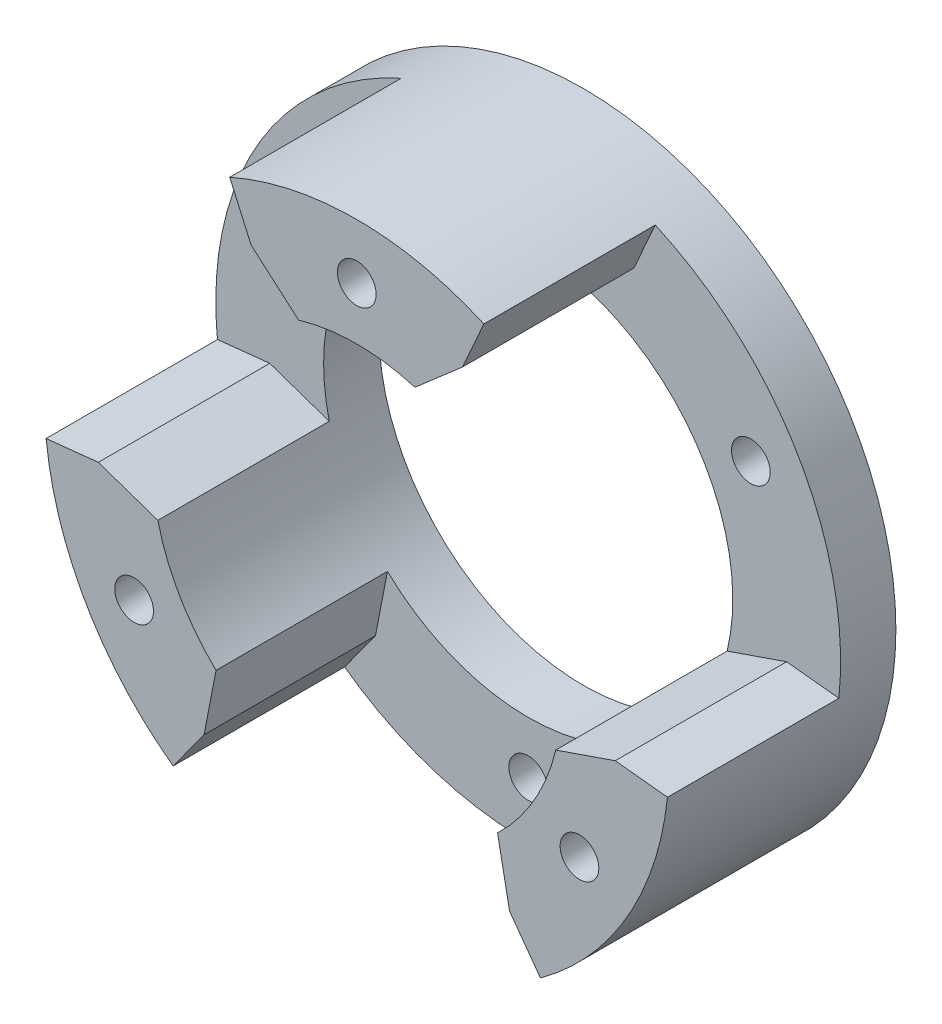
ISO-10303-21;
HEADER;
FILE_DESCRIPTION(('STEP AP214'),'2;1');
FILE_NAME('part.step','',(''),(''),'','','');
FILE_SCHEMA(('AUTOMOTIVE_DESIGN { 1 0 10303 214 1 1 1 1 }'));
ENDSEC;
DATA;
#1=APPLICATION_CONTEXT('core data for automotive mechanical design processes');
#2=APPLICATION_PROTOCOL_DEFINITION('international standard','automotive_design',2000,#1);
#3=PRODUCT_CONTEXT('',#1,'mechanical');
#4=PRODUCT('Part','Part','',(#3));
#5=PRODUCT_RELATED_PRODUCT_CATEGORY('part','',(#4));
#6=PRODUCT_DEFINITION_FORMATION('','',#4);
#7=PRODUCT_DEFINITION_CONTEXT('part definition',#1,'design');
#8=PRODUCT_DEFINITION('design','',#6,#7);
#9=PRODUCT_DEFINITION_SHAPE('','',#8);
#10=(LENGTH_UNIT() NAMED_UNIT(*) SI_UNIT(.MILLI.,.METRE.));
#11=(NAMED_UNIT(*) PLANE_ANGLE_UNIT() SI_UNIT($,.RADIAN.));
#12=(NAMED_UNIT(*) SI_UNIT($,.STERADIAN.) SOLID_ANGLE_UNIT());
#13=UNCERTAINTY_MEASURE_WITH_UNIT(LENGTH_MEASURE(1.E-05),#10,'distance_accuracy_value','');
#14=(GEOMETRIC_REPRESENTATION_CONTEXT(3) GLOBAL_UNCERTAINTY_ASSIGNED_CONTEXT((#13)) GLOBAL_UNIT_ASSIGNED_CONTEXT((#10,
#11,#12)) REPRESENTATION_CONTEXT('',''));
#15=CARTESIAN_POINT('',(0.,0.,0.));
#16=DIRECTION('',(0.,0.,1.));
#17=DIRECTION('',(1.,0.,0.));
#18=AXIS2_PLACEMENT_3D('',#15,#16,#17);
#19=CARTESIAN_POINT('',(0.,28.25,3.));
#20=DIRECTION('',(0.,0.,1.));
#21=DIRECTION('',(1.,0.,0.));
#22=AXIS2_PLACEMENT_3D('',#19,#20,#21);
#23=PLANE('',#22);
#24=CARTESIAN_POINT('',(0.,-23.25,3.));
#25=DIRECTION('',(0.,0.,1.));
#26=DIRECTION('',(1.,0.,0.));
#27=AXIS2_PLACEMENT_3D('',#24,#25,#26);
#28=CIRCLE('',#27,1.75);
#29=CARTESIAN_POINT('',(1.75,-23.25,3.));
#30=VERTEX_POINT('',#29);
#31=EDGE_CURVE('E406',#30,#30,#28,.T.);
#32=ORIENTED_EDGE('',*,*,#31,.F.);
#33=EDGE_LOOP('',(#32));
#34=FACE_BOUND('',#33,.T.);
#35=CARTESIAN_POINT('',(0.,0.,3.));
#36=DIRECTION('',(0.,0.,-1.));
#37=DIRECTION('',(-1.,0.,0.));
#38=AXIS2_PLACEMENT_3D('',#35,#36,#37);
#39=CIRCLE('',#38,18.5);
#40=CARTESIAN_POINT('',(12.7272367457324,-13.4263712453543,3.));
#41=VERTEX_POINT('',#40);
#42=CARTESIAN_POINT('',(-12.7272367457326,-13.4263712453542,3.));
#43=VERTEX_POINT('',#42);
#44=EDGE_CURVE('E245',#41,#43,#39,.T.);
#45=ORIENTED_EDGE('',*,*,#44,.T.);
#46=DIRECTION('',(0.190808995376554,0.981627183447662,0.));
#47=VECTOR('',#46,1.);
#48=CARTESIAN_POINT('',(-12.7272367457326,-13.4263712453542,3.));
#49=LINE('',#48,#47);
#50=CARTESIAN_POINT('',(-13.8129534288733,-19.0118993678112,3.));
#51=VERTEX_POINT('',#50);
#52=EDGE_CURVE('E11',#43,#51,#49,.F.);
#53=ORIENTED_EDGE('',*,*,#52,.T.);
#54=DIRECTION('',(0.58778525229248,0.809016994374942,0.));
#55=VECTOR('',#54,1.);
#56=CARTESIAN_POINT('',(-10.8740271674109,-14.9668143959364,3.));
#57=LINE('',#56,#55);
#58=CARTESIAN_POINT('',(-16.6049333772626,-22.8547300910921,3.));
#59=VERTEX_POINT('',#58);
#60=EDGE_CURVE('E316',#59,#51,#57,.T.);
#61=ORIENTED_EDGE('',*,*,#60,.F.);
#62=CARTESIAN_POINT('',(0.,0.,3.));
#63=DIRECTION('',(0.,0.,-1.));
#64=DIRECTION('',(-1.,0.,0.));
#65=AXIS2_PLACEMENT_3D('',#62,#63,#64);
#66=CIRCLE('',#65,28.25);
#67=CARTESIAN_POINT('',(16.6049333772622,-22.8547300910924,3.));
#68=VERTEX_POINT('',#67);
#69=EDGE_CURVE('E187',#68,#59,#66,.T.);
#70=ORIENTED_EDGE('',*,*,#69,.F.);
#71=DIRECTION('',(0.587785252292469,-0.809016994374951,0.));
#72=VECTOR('',#71,1.);
#73=CARTESIAN_POINT('',(10.8740271674107,-14.9668143959366,3.));
#74=LINE('',#73,#72);
#75=CARTESIAN_POINT('',(13.812953428873,-19.0118993678114,3.));
#76=VERTEX_POINT('',#75);
#77=EDGE_CURVE('E192',#76,#68,#74,.T.);
#78=ORIENTED_EDGE('',*,*,#77,.F.);
#79=DIRECTION('',(0.190808995376541,-0.981627183447665,0.));
#80=VECTOR('',#79,1.);
#81=CARTESIAN_POINT('',(13.812953428873,-19.0118993678114,3.));
#82=LINE('',#81,#80);
#83=EDGE_CURVE('E281',#76,#41,#82,.F.);
#84=ORIENTED_EDGE('',*,*,#83,.T.);
#85=EDGE_LOOP('',(#45,#53,#61,#70,#78,#84));
#86=FACE_BOUND('',#85,.T.);
#87=ADVANCED_FACE('F39',(#34,#86),#23,.T.);
#88=CARTESIAN_POINT('',(-20.1350906379881,11.6250000000001,3.));
#89=DIRECTION('',(0.,0.,1.));
#90=DIRECTION('',(-0.500000000000004,-0.866025403784436,0.));
#91=AXIS2_PLACEMENT_3D('',#88,#89,#90);
#92=CIRCLE('',#91,1.75);
#93=CARTESIAN_POINT('',(-21.0100906379882,10.1094555433773,3.));
#94=VERTEX_POINT('',#93);
#95=EDGE_CURVE('E398',#94,#94,#92,.T.);
#96=ORIENTED_EDGE('',*,*,#95,.F.);
#97=EDGE_LOOP('',(#96));
#98=FACE_BOUND('',#97,.T.);
#99=CARTESIAN_POINT('',(-28.0952435441538,-2.95292908731092,3.));
#100=VERTEX_POINT('',#99);
#101=CARTESIAN_POINT('',(-11.4903101668914,25.8076591784035,3.));
#102=VERTEX_POINT('',#101);
#103=EDGE_CURVE('E238',#100,#102,#66,.T.);
#104=ORIENTED_EDGE('',*,*,#103,.F.);
#105=DIRECTION('',(-0.994521895368274,-0.104528463267643,0.));
#106=VECTOR('',#105,1.);
#107=CARTESIAN_POINT('',(-18.3986550643131,-1.9337765704514,3.));
#108=LINE('',#107,#106);
#109=CARTESIAN_POINT('',(-23.3712645411545,-2.45641888678962,3.));
#110=VERTEX_POINT('',#109);
#111=EDGE_CURVE('E179',#110,#100,#108,.T.);
#112=ORIENTED_EDGE('',*,*,#111,.F.);
#113=DIRECTION('',(-0.945518575599314,0.325568154457164,0.));
#114=VECTOR('',#113,1.);
#115=CARTESIAN_POINT('',(-23.3712645411545,-2.45641888678962,3.));
#116=LINE('',#115,#114);
#117=CARTESIAN_POINT('',(-17.991196951984,-4.30892471910583,3.));
#118=VERTEX_POINT('',#117);
#119=EDGE_CURVE('E48',#110,#118,#116,.F.);
#120=ORIENTED_EDGE('',*,*,#119,.T.);
#121=CARTESIAN_POINT('',(-5.26396020625147,17.7352959644603,3.));
#122=VERTEX_POINT('',#121);
#123=EDGE_CURVE('E241',#118,#122,#39,.T.);
#124=ORIENTED_EDGE('',*,*,#123,.T.);
#125=DIRECTION('',(0.754709580222771,-0.656059028990509,0.));
#126=VECTOR('',#125,1.);
#127=CARTESIAN_POINT('',(-5.26396020625147,17.7352959644603,3.));
#128=LINE('',#127,#126);
#129=CARTESIAN_POINT('',(-9.55831111228134,21.4683182546012,3.));
#130=VERTEX_POINT('',#129);
#131=EDGE_CURVE('E265',#122,#130,#128,.F.);
#132=ORIENTED_EDGE('',*,*,#131,.T.);
#133=DIRECTION('',(0.406736643075801,-0.913545457642601,0.));
#134=VECTOR('',#133,1.);
#135=CARTESIAN_POINT('',(-7.52462789690232,16.9005909663881,3.));
#136=LINE('',#135,#134);
#137=EDGE_CURVE('E213',#102,#130,#136,.T.);
#138=ORIENTED_EDGE('',*,*,#137,.F.);
#139=EDGE_LOOP('',(#104,#112,#120,#124,#132,#138));
#140=FACE_BOUND('',#139,.T.);
#141=ADVANCED_FACE('F303',(#98,#140),#23,.T.);
#142=CARTESIAN_POINT('',(20.1350906379883,11.6249999999998,3.));
#143=DIRECTION('',(0.,0.,1.));
#144=DIRECTION('',(-0.499999999999992,0.866025403784443,0.));
#145=AXIS2_PLACEMENT_3D('',#142,#143,#144);
#146=CIRCLE('',#145,1.75);
#147=CARTESIAN_POINT('',(19.2600906379883,13.1405444566226,3.));
#148=VERTEX_POINT('',#147);
#149=EDGE_CURVE('E393',#148,#148,#146,.T.);
#150=ORIENTED_EDGE('',*,*,#149,.F.);
#151=EDGE_LOOP('',(#150));
#152=FACE_BOUND('',#151,.T.);
#153=CARTESIAN_POINT('',(5.26396020625147,17.7352959644603,3.));
#154=VERTEX_POINT('',#153);
#155=CARTESIAN_POINT('',(17.991196951984,-4.30892471910608,3.));
#156=VERTEX_POINT('',#155);
#157=EDGE_CURVE('E242',#154,#156,#39,.T.);
#158=ORIENTED_EDGE('',*,*,#157,.T.);
#159=DIRECTION('',(-0.945518575599319,-0.325568154457151,0.));
#160=VECTOR('',#159,1.);
#161=CARTESIAN_POINT('',(17.991196951984,-4.30892471910608,3.));
#162=LINE('',#161,#160);
#163=CARTESIAN_POINT('',(23.3712645411545,-2.45641888678995,3.));
#164=VERTEX_POINT('',#163);
#165=EDGE_CURVE('E284',#156,#164,#162,.F.);
#166=ORIENTED_EDGE('',*,*,#165,.T.);
#167=DIRECTION('',(-0.994521895368273,0.104528463267657,0.));
#168=VECTOR('',#167,1.);
#169=CARTESIAN_POINT('',(18.3986550643131,-1.93377657045166,3.));
#170=LINE('',#169,#168);
#171=CARTESIAN_POINT('',(28.0952435441537,-2.95292908731132,3.));
#172=VERTEX_POINT('',#171);
#173=EDGE_CURVE('E188',#172,#164,#170,.T.);
#174=ORIENTED_EDGE('',*,*,#173,.F.);
#175=CARTESIAN_POINT('',(11.4903101668914,25.8076591784035,3.));
#176=VERTEX_POINT('',#175);
#177=EDGE_CURVE('E239',#176,#172,#66,.T.);
#178=ORIENTED_EDGE('',*,*,#177,.F.);
#179=DIRECTION('',(0.406736643075801,0.913545457642601,0.));
#180=VECTOR('',#179,1.);
#181=CARTESIAN_POINT('',(7.52462789690232,16.9005909663881,3.));
#182=LINE('',#181,#180);
#183=CARTESIAN_POINT('',(9.55831111228134,21.4683182546012,3.));
#184=VERTEX_POINT('',#183);
#185=EDGE_CURVE('E218',#184,#176,#182,.T.);
#186=ORIENTED_EDGE('',*,*,#185,.F.);
#187=DIRECTION('',(0.754709580222771,0.656059028990509,0.));
#188=VECTOR('',#187,1.);
#189=CARTESIAN_POINT('',(9.55831111228134,21.4683182546012,3.));
#190=LINE('',#189,#188);
#191=EDGE_CURVE('E262',#184,#154,#190,.F.);
#192=ORIENTED_EDGE('',*,*,#191,.T.);
#193=EDGE_LOOP('',(#158,#166,#174,#178,#186,#192));
#194=FACE_BOUND('',#193,.T.);
#195=ADVANCED_FACE('F339',(#152,#194),#23,.T.);
#196=CARTESIAN_POINT('',(0.,28.25,-2.));
#197=DIRECTION('',(0.,0.,-1.));
#198=DIRECTION('',(-1.,0.,0.));
#199=AXIS2_PLACEMENT_3D('',#196,#197,#198);
#200=PLANE('',#199);
#201=CARTESIAN_POINT('',(-20.1350906379881,11.6250000000001,-2.));
#202=DIRECTION('',(0.,0.,1.));
#203=DIRECTION('',(-0.500000000000004,-0.866025403784436,0.));
#204=AXIS2_PLACEMENT_3D('',#201,#202,#203);
#205=CIRCLE('',#204,1.75);
#206=CARTESIAN_POINT('',(-21.0100906379882,10.1094555433773,-2.));
#207=VERTEX_POINT('',#206);
#208=EDGE_CURVE('E409',#207,#207,#205,.T.);
#209=ORIENTED_EDGE('',*,*,#208,.T.);
#210=EDGE_LOOP('',(#209));
#211=FACE_BOUND('',#210,.T.);
#212=CARTESIAN_POINT('',(20.1350906379883,11.6249999999998,-2.));
#213=DIRECTION('',(0.,0.,1.));
#214=DIRECTION('',(-0.499999999999992,0.866025403784443,0.));
#215=AXIS2_PLACEMENT_3D('',#212,#213,#214);
#216=CIRCLE('',#215,1.75);
#217=CARTESIAN_POINT('',(19.2600906379883,13.1405444566226,-2.));
#218=VERTEX_POINT('',#217);
#219=EDGE_CURVE('E395',#218,#218,#216,.T.);
#220=ORIENTED_EDGE('',*,*,#219,.T.);
#221=EDGE_LOOP('',(#220));
#222=FACE_BOUND('',#221,.T.);
#223=CARTESIAN_POINT('',(0.,-23.25,-2.));
#224=DIRECTION('',(0.,0.,1.));
#225=DIRECTION('',(1.,0.,0.));
#226=AXIS2_PLACEMENT_3D('',#223,#224,#225);
#227=CIRCLE('',#226,1.75);
#228=CARTESIAN_POINT('',(1.75,-23.25,-2.));
#229=VERTEX_POINT('',#228);
#230=EDGE_CURVE('E402',#229,#229,#227,.T.);
#231=ORIENTED_EDGE('',*,*,#230,.T.);
#232=EDGE_LOOP('',(#231));
#233=FACE_BOUND('',#232,.T.);
#234=CARTESIAN_POINT('',(0.,0.,-2.));
#235=DIRECTION('',(0.,0.,-1.));
#236=DIRECTION('',(-1.,0.,0.));
#237=AXIS2_PLACEMENT_3D('',#234,#235,#236);
#238=CIRCLE('',#237,28.25);
#239=CARTESIAN_POINT('',(-28.25,0.,-2.));
#240=VERTEX_POINT('',#239);
#241=EDGE_CURVE('E235',#240,#240,#238,.T.);
#242=ORIENTED_EDGE('',*,*,#241,.T.);
#243=EDGE_LOOP('',(#242));
#244=FACE_BOUND('',#243,.T.);
#245=CARTESIAN_POINT('',(0.,0.,-2.));
#246=DIRECTION('',(0.,0.,-1.));
#247=DIRECTION('',(-1.,0.,0.));
#248=AXIS2_PLACEMENT_3D('',#245,#246,#247);
#249=CIRCLE('',#248,18.5);
#250=CARTESIAN_POINT('',(-18.5,0.,-2.));
#251=VERTEX_POINT('',#250);
#252=EDGE_CURVE('E244',#251,#251,#249,.T.);
#253=ORIENTED_EDGE('',*,*,#252,.F.);
#254=EDGE_LOOP('',(#253));
#255=FACE_BOUND('',#254,.T.);
#256=ADVANCED_FACE('F384',(#211,#222,#233,#244,#255),#200,.T.);
#257=CARTESIAN_POINT('',(0.,0.,0.));
#258=DIRECTION('',(0.,0.,-1.));
#259=DIRECTION('',(-1.,0.,0.));
#260=AXIS2_PLACEMENT_3D('',#257,#258,#259);
#261=CYLINDRICAL_SURFACE('',#260,18.5);
#262=ORIENTED_EDGE('',*,*,#252,.T.);
#263=EDGE_LOOP('',(#262));
#264=FACE_BOUND('',#263,.T.);
#265=ORIENTED_EDGE('',*,*,#123,.F.);
#266=DIRECTION('',(0.,0.,-1.));
#267=VECTOR('',#266,1.);
#268=CARTESIAN_POINT('',(-17.991196951984,-4.30892471910583,0.));
#269=LINE('',#268,#267);
#270=CARTESIAN_POINT('',(-17.991196951984,-4.30892471910583,18.5));
#271=VERTEX_POINT('',#270);
#272=EDGE_CURVE('E292',#118,#271,#269,.F.);
#273=ORIENTED_EDGE('',*,*,#272,.T.);
#274=CARTESIAN_POINT('',(0.,0.,18.5));
#275=DIRECTION('',(0.,0.,-1.));
#276=DIRECTION('',(-0.499999999999992,0.866025403784443,0.));
#277=AXIS2_PLACEMENT_3D('',#274,#275,#276);
#278=CIRCLE('',#277,18.5);
#279=CARTESIAN_POINT('',(-12.7272367457326,-13.4263712453542,18.5));
#280=VERTEX_POINT('',#279);
#281=EDGE_CURVE('E168',#280,#271,#278,.T.);
#282=ORIENTED_EDGE('',*,*,#281,.F.);
#283=DIRECTION('',(0.,0.,-1.));
#284=VECTOR('',#283,1.);
#285=CARTESIAN_POINT('',(-12.7272367457326,-13.4263712453542,0.));
#286=LINE('',#285,#284);
#287=EDGE_CURVE('E289',#280,#43,#286,.T.);
#288=ORIENTED_EDGE('',*,*,#287,.T.);
#289=ORIENTED_EDGE('',*,*,#44,.F.);
#290=DIRECTION('',(0.,0.,-1.));
#291=VECTOR('',#290,1.);
#292=CARTESIAN_POINT('',(12.7272367457324,-13.4263712453543,0.));
#293=LINE('',#292,#291);
#294=CARTESIAN_POINT('',(12.7272367457324,-13.4263712453543,18.5));
#295=VERTEX_POINT('',#294);
#296=EDGE_CURVE('E273',#41,#295,#293,.F.);
#297=ORIENTED_EDGE('',*,*,#296,.T.);
#298=CARTESIAN_POINT('',(0.,0.,18.5));
#299=DIRECTION('',(0.,0.,-1.));
#300=DIRECTION('',(-0.500000000000004,-0.866025403784436,0.));
#301=AXIS2_PLACEMENT_3D('',#298,#299,#300);
#302=CIRCLE('',#301,18.5);
#303=CARTESIAN_POINT('',(17.991196951984,-4.30892471910608,18.5));
#304=VERTEX_POINT('',#303);
#305=EDGE_CURVE('E203',#304,#295,#302,.T.);
#306=ORIENTED_EDGE('',*,*,#305,.F.);
#307=DIRECTION('',(0.,0.,-1.));
#308=VECTOR('',#307,1.);
#309=CARTESIAN_POINT('',(17.9911969519839,-4.30892471910608,0.));
#310=LINE('',#309,#308);
#311=EDGE_CURVE('E270',#304,#156,#310,.T.);
#312=ORIENTED_EDGE('',*,*,#311,.T.);
#313=ORIENTED_EDGE('',*,*,#157,.F.);
#314=DIRECTION('',(0.,0.,-1.));
#315=VECTOR('',#314,1.);
#316=CARTESIAN_POINT('',(5.26396020625147,17.7352959644603,0.));
#317=LINE('',#316,#315);
#318=CARTESIAN_POINT('',(5.26396020625147,17.7352959644603,18.5));
#319=VERTEX_POINT('',#318);
#320=EDGE_CURVE('E254',#154,#319,#317,.F.);
#321=ORIENTED_EDGE('',*,*,#320,.T.);
#322=CARTESIAN_POINT('',(0.,0.,18.5));
#323=DIRECTION('',(0.,0.,-1.));
#324=DIRECTION('',(1.,0.,0.));
#325=AXIS2_PLACEMENT_3D('',#322,#323,#324);
#326=CIRCLE('',#325,18.5);
#327=CARTESIAN_POINT('',(-5.26396020625147,17.7352959644603,18.5));
#328=VERTEX_POINT('',#327);
#329=EDGE_CURVE('E221',#328,#319,#326,.T.);
#330=ORIENTED_EDGE('',*,*,#329,.F.);
#331=DIRECTION('',(0.,0.,-1.));
#332=VECTOR('',#331,1.);
#333=CARTESIAN_POINT('',(-5.26396020625147,17.7352959644603,0.));
#334=LINE('',#333,#332);
#335=EDGE_CURVE('E251',#328,#122,#334,.T.);
#336=ORIENTED_EDGE('',*,*,#335,.T.);
#337=EDGE_LOOP('',(#265,#273,#282,#288,#289,#297,#306,#312,#313,#321,#330,#336));
#338=FACE_BOUND('',#337,.T.);
#339=ADVANCED_FACE('F311',(#264,#338),#261,.F.);
#340=CARTESIAN_POINT('',(0.,0.,0.));
#341=DIRECTION('',(0.,0.,-1.));
#342=DIRECTION('',(-1.,0.,0.));
#343=AXIS2_PLACEMENT_3D('',#340,#341,#342);
#344=CYLINDRICAL_SURFACE('',#343,28.25);
#345=ORIENTED_EDGE('',*,*,#177,.T.);
#346=DIRECTION('',(0.,0.,-1.));
#347=VECTOR('',#346,1.);
#348=CARTESIAN_POINT('',(28.0952435441537,-2.95292908731132,18.5));
#349=LINE('',#348,#347);
#350=CARTESIAN_POINT('',(28.0952435441537,-2.95292908731132,18.5));
#351=VERTEX_POINT('',#350);
#352=EDGE_CURVE('E211',#351,#172,#349,.T.);
#353=ORIENTED_EDGE('',*,*,#352,.F.);
#354=CARTESIAN_POINT('',(0.,0.,18.5));
#355=DIRECTION('',(0.,0.,1.));
#356=DIRECTION('',(-0.500000000000004,-0.866025403784436,0.));
#357=AXIS2_PLACEMENT_3D('',#354,#355,#356);
#358=CIRCLE('',#357,28.25);
#359=CARTESIAN_POINT('',(16.6049333772622,-22.8547300910924,18.5));
#360=VERTEX_POINT('',#359);
#361=EDGE_CURVE('E197',#360,#351,#358,.T.);
#362=ORIENTED_EDGE('',*,*,#361,.F.);
#363=DIRECTION('',(0.,0.,-1.));
#364=VECTOR('',#363,1.);
#365=CARTESIAN_POINT('',(16.6049333772622,-22.8547300910924,18.5));
#366=LINE('',#365,#364);
#367=EDGE_CURVE('E207',#360,#68,#366,.T.);
#368=ORIENTED_EDGE('',*,*,#367,.T.);
#369=ORIENTED_EDGE('',*,*,#69,.T.);
#370=DIRECTION('',(0.,0.,-1.));
#371=VECTOR('',#370,1.);
#372=CARTESIAN_POINT('',(-16.6049333772626,-22.8547300910921,18.5));
#373=LINE('',#372,#371);
#374=CARTESIAN_POINT('',(-16.6049333772626,-22.8547300910921,18.5));
#375=VERTEX_POINT('',#374);
#376=EDGE_CURVE('E165',#375,#59,#373,.T.);
#377=ORIENTED_EDGE('',*,*,#376,.F.);
#378=CARTESIAN_POINT('',(0.,0.,18.5));
#379=DIRECTION('',(0.,0.,1.));
#380=DIRECTION('',(-0.499999999999992,0.866025403784443,0.));
#381=AXIS2_PLACEMENT_3D('',#378,#379,#380);
#382=CIRCLE('',#381,28.25);
#383=CARTESIAN_POINT('',(-28.0952435441538,-2.95292908731092,18.5));
#384=VERTEX_POINT('',#383);
#385=EDGE_CURVE('E169',#384,#375,#382,.T.);
#386=ORIENTED_EDGE('',*,*,#385,.F.);
#387=DIRECTION('',(0.,0.,-1.));
#388=VECTOR('',#387,1.);
#389=CARTESIAN_POINT('',(-28.0952435441538,-2.95292908731092,18.5));
#390=LINE('',#389,#388);
#391=EDGE_CURVE('E189',#384,#100,#390,.T.);
#392=ORIENTED_EDGE('',*,*,#391,.T.);
#393=ORIENTED_EDGE('',*,*,#103,.T.);
#394=DIRECTION('',(0.,0.,-1.));
#395=VECTOR('',#394,1.);
#396=CARTESIAN_POINT('',(-11.4903101668914,25.8076591784035,18.5));
#397=LINE('',#396,#395);
#398=CARTESIAN_POINT('',(-11.4903101668914,25.8076591784035,18.5));
#399=VERTEX_POINT('',#398);
#400=EDGE_CURVE('E232',#399,#102,#397,.T.);
#401=ORIENTED_EDGE('',*,*,#400,.F.);
#402=CARTESIAN_POINT('',(0.,0.,18.5));
#403=DIRECTION('',(0.,0.,1.));
#404=DIRECTION('',(1.,0.,0.));
#405=AXIS2_PLACEMENT_3D('',#402,#403,#404);
#406=CIRCLE('',#405,28.25);
#407=CARTESIAN_POINT('',(11.4903101668914,25.8076591784035,18.5));
#408=VERTEX_POINT('',#407);
#409=EDGE_CURVE('E214',#408,#399,#406,.T.);
#410=ORIENTED_EDGE('',*,*,#409,.F.);
#411=DIRECTION('',(0.,0.,-1.));
#412=VECTOR('',#411,1.);
#413=CARTESIAN_POINT('',(11.4903101668914,25.8076591784035,18.5));
#414=LINE('',#413,#412);
#415=EDGE_CURVE('E226',#408,#176,#414,.T.);
#416=ORIENTED_EDGE('',*,*,#415,.T.);
#417=EDGE_LOOP('',(#345,#353,#362,#368,#369,#377,#386,#392,#393,#401,#410,#416));
#418=FACE_BOUND('',#417,.T.);
#419=ORIENTED_EDGE('',*,*,#241,.F.);
#420=EDGE_LOOP('',(#419));
#421=FACE_BOUND('',#420,.T.);
#422=ADVANCED_FACE('F183',(#418,#421),#344,.T.);
#423=CARTESIAN_POINT('',(-7.52462789690232,16.9005909663881,18.5));
#424=DIRECTION('',(0.913545457642601,0.406736643075801,0.));
#425=DIRECTION('',(-0.406736643075801,0.913545457642601,0.));
#426=AXIS2_PLACEMENT_3D('',#423,#424,#425);
#427=PLANE('',#426);
#428=ORIENTED_EDGE('',*,*,#137,.T.);
#429=DIRECTION('',(0.,0.,1.));
#430=VECTOR('',#429,1.);
#431=CARTESIAN_POINT('',(-9.55831111228134,21.4683182546012,18.5));
#432=LINE('',#431,#430);
#433=CARTESIAN_POINT('',(-9.55831111228134,21.4683182546012,18.5));
#434=VERTEX_POINT('',#433);
#435=EDGE_CURVE('E260',#130,#434,#432,.T.);
#436=ORIENTED_EDGE('',*,*,#435,.T.);
#437=DIRECTION('',(0.406736643075801,-0.913545457642601,0.));
#438=VECTOR('',#437,1.);
#439=CARTESIAN_POINT('',(-7.52462789690232,16.9005909663881,18.5));
#440=LINE('',#439,#438);
#441=EDGE_CURVE('E217',#399,#434,#440,.T.);
#442=ORIENTED_EDGE('',*,*,#441,.F.);
#443=ORIENTED_EDGE('',*,*,#400,.T.);
#444=EDGE_LOOP('',(#428,#436,#442,#443));
#445=FACE_BOUND('',#444,.T.);
#446=ADVANCED_FACE('F324',(#445),#427,.F.);
#447=CARTESIAN_POINT('',(7.52462789690232,16.9005909663881,18.5));
#448=DIRECTION('',(-0.913545457642601,0.406736643075801,0.));
#449=DIRECTION('',(-0.406736643075801,-0.913545457642601,0.));
#450=AXIS2_PLACEMENT_3D('',#447,#448,#449);
#451=PLANE('',#450);
#452=DIRECTION('',(0.406736643075801,0.913545457642601,0.));
#453=VECTOR('',#452,1.);
#454=CARTESIAN_POINT('',(7.52462789690232,16.9005909663881,18.5));
#455=LINE('',#454,#453);
#456=CARTESIAN_POINT('',(9.55831111228134,21.4683182546012,18.5));
#457=VERTEX_POINT('',#456);
#458=EDGE_CURVE('E224',#457,#408,#455,.T.);
#459=ORIENTED_EDGE('',*,*,#458,.F.);
#460=DIRECTION('',(0.,0.,-1.));
#461=VECTOR('',#460,1.);
#462=CARTESIAN_POINT('',(9.55831111228135,21.4683182546012,3.));
#463=LINE('',#462,#461);
#464=EDGE_CURVE('E248',#457,#184,#463,.T.);
#465=ORIENTED_EDGE('',*,*,#464,.T.);
#466=ORIENTED_EDGE('',*,*,#185,.T.);
#467=ORIENTED_EDGE('',*,*,#415,.F.);
#468=EDGE_LOOP('',(#459,#465,#466,#467));
#469=FACE_BOUND('',#468,.T.);
#470=ADVANCED_FACE('F334',(#469),#451,.F.);
#471=CARTESIAN_POINT('',(0.,0.,18.5));
#472=DIRECTION('',(0.,0.,1.));
#473=DIRECTION('',(1.,0.,0.));
#474=AXIS2_PLACEMENT_3D('',#471,#472,#473);
#475=PLANE('',#474);
#476=CARTESIAN_POINT('',(0.,23.25,18.5));
#477=DIRECTION('',(0.,0.,1.));
#478=DIRECTION('',(1.,0.,0.));
#479=AXIS2_PLACEMENT_3D('',#476,#477,#478);
#480=CIRCLE('',#479,1.75);
#481=CARTESIAN_POINT('',(1.75,23.25,18.5));
#482=VERTEX_POINT('',#481);
#483=EDGE_CURVE('E413',#482,#482,#480,.T.);
#484=ORIENTED_EDGE('',*,*,#483,.F.);
#485=EDGE_LOOP('',(#484));
#486=FACE_BOUND('',#485,.T.);
#487=ORIENTED_EDGE('',*,*,#329,.T.);
#488=DIRECTION('',(-0.754709580222771,-0.656059028990509,0.));
#489=VECTOR('',#488,1.);
#490=CARTESIAN_POINT('',(-6.51566937113458,7.49542019645078,18.5));
#491=LINE('',#490,#489);
#492=EDGE_CURVE('E258',#319,#457,#491,.F.);
#493=ORIENTED_EDGE('',*,*,#492,.T.);
#494=ORIENTED_EDGE('',*,*,#458,.T.);
#495=ORIENTED_EDGE('',*,*,#409,.T.);
#496=ORIENTED_EDGE('',*,*,#441,.T.);
#497=DIRECTION('',(-0.754709580222771,0.656059028990509,0.));
#498=VECTOR('',#497,1.);
#499=CARTESIAN_POINT('',(6.51566937113458,7.49542019645078,18.5));
#500=LINE('',#499,#498);
#501=EDGE_CURVE('E256',#434,#328,#500,.F.);
#502=ORIENTED_EDGE('',*,*,#501,.T.);
#503=EDGE_LOOP('',(#487,#493,#494,#495,#496,#502));
#504=FACE_BOUND('',#503,.T.);
#505=ADVANCED_FACE('F328',(#486,#504),#475,.T.);
#506=CARTESIAN_POINT('',(9.55831111228134,21.4683182546012,0.));
#507=DIRECTION('',(-0.656059028990509,0.754709580222771,0.));
#508=DIRECTION('',(0.,0.,-1.));
#509=AXIS2_PLACEMENT_3D('',#506,#507,#508);
#510=PLANE('',#509);
#511=ORIENTED_EDGE('',*,*,#492,.F.);
#512=ORIENTED_EDGE('',*,*,#320,.F.);
#513=ORIENTED_EDGE('',*,*,#191,.F.);
#514=ORIENTED_EDGE('',*,*,#464,.F.);
#515=EDGE_LOOP('',(#511,#512,#513,#514));
#516=FACE_BOUND('',#515,.T.);
#517=ADVANCED_FACE('F430',(#516),#510,.F.);
#518=CARTESIAN_POINT('',(-5.26396020625147,17.7352959644603,0.));
#519=DIRECTION('',(0.656059028990509,0.754709580222771,0.));
#520=DIRECTION('',(0.,0.,-1.));
#521=AXIS2_PLACEMENT_3D('',#518,#519,#520);
#522=PLANE('',#521);
#523=ORIENTED_EDGE('',*,*,#501,.F.);
#524=ORIENTED_EDGE('',*,*,#435,.F.);
#525=ORIENTED_EDGE('',*,*,#131,.F.);
#526=ORIENTED_EDGE('',*,*,#335,.F.);
#527=EDGE_LOOP('',(#523,#524,#525,#526));
#528=FACE_BOUND('',#527,.T.);
#529=ADVANCED_FACE('F436',(#528),#522,.F.);
#530=CARTESIAN_POINT('',(18.3986550643131,-1.93377657045166,18.5));
#531=DIRECTION('',(-0.104528463267657,-0.994521895368273,0.));
#532=DIRECTION('',(0.994521895368273,-0.104528463267657,0.));
#533=AXIS2_PLACEMENT_3D('',#530,#531,#532);
#534=PLANE('',#533);
#535=ORIENTED_EDGE('',*,*,#173,.T.);
#536=DIRECTION('',(0.,0.,1.));
#537=VECTOR('',#536,1.);
#538=CARTESIAN_POINT('',(23.3712645411545,-2.45641888678995,18.5));
#539=LINE('',#538,#537);
#540=CARTESIAN_POINT('',(23.3712645411545,-2.45641888678995,18.5));
#541=VERTEX_POINT('',#540);
#542=EDGE_CURVE('E279',#164,#541,#539,.T.);
#543=ORIENTED_EDGE('',*,*,#542,.T.);
#544=DIRECTION('',(-0.994521895368273,0.104528463267657,0.));
#545=VECTOR('',#544,1.);
#546=CARTESIAN_POINT('',(18.3986550643131,-1.93377657045166,18.5));
#547=LINE('',#546,#545);
#548=EDGE_CURVE('E200',#351,#541,#547,.T.);
#549=ORIENTED_EDGE('',*,*,#548,.F.);
#550=ORIENTED_EDGE('',*,*,#352,.T.);
#551=EDGE_LOOP('',(#535,#543,#549,#550));
#552=FACE_BOUND('',#551,.T.);
#553=ADVANCED_FACE('F343',(#552),#534,.F.);
#554=CARTESIAN_POINT('',(10.8740271674107,-14.9668143959366,18.5));
#555=DIRECTION('',(0.809016994374951,0.587785252292469,0.));
#556=DIRECTION('',(-0.587785252292469,0.809016994374951,0.));
#557=AXIS2_PLACEMENT_3D('',#554,#555,#556);
#558=PLANE('',#557);
#559=DIRECTION('',(0.587785252292469,-0.809016994374951,0.));
#560=VECTOR('',#559,1.);
#561=CARTESIAN_POINT('',(10.8740271674107,-14.9668143959366,18.5));
#562=LINE('',#561,#560);
#563=CARTESIAN_POINT('',(13.812953428873,-19.0118993678114,18.5));
#564=VERTEX_POINT('',#563);
#565=EDGE_CURVE('E206',#564,#360,#562,.T.);
#566=ORIENTED_EDGE('',*,*,#565,.F.);
#567=DIRECTION('',(0.,0.,-1.));
#568=VECTOR('',#567,1.);
#569=CARTESIAN_POINT('',(13.812953428873,-19.0118993678114,3.));
#570=LINE('',#569,#568);
#571=EDGE_CURVE('E267',#564,#76,#570,.T.);
#572=ORIENTED_EDGE('',*,*,#571,.T.);
#573=ORIENTED_EDGE('',*,*,#77,.T.);
#574=ORIENTED_EDGE('',*,*,#367,.F.);
#575=EDGE_LOOP('',(#566,#572,#573,#574));
#576=FACE_BOUND('',#575,.T.);
#577=ADVANCED_FACE('F353',(#576),#558,.F.);
#578=CARTESIAN_POINT('',(0.,0.,18.5));
#579=DIRECTION('',(0.,0.,1.));
#580=DIRECTION('',(-0.500000000000004,-0.866025403784436,0.));
#581=AXIS2_PLACEMENT_3D('',#578,#579,#580);
#582=PLANE('',#581);
#583=CARTESIAN_POINT('',(20.1350906379881,-11.6250000000001,18.5));
#584=DIRECTION('',(0.,0.,1.));
#585=DIRECTION('',(-0.500000000000004,-0.866025403784436,0.));
#586=AXIS2_PLACEMENT_3D('',#583,#584,#585);
#587=CIRCLE('',#586,1.75);
#588=CARTESIAN_POINT('',(19.2600906379881,-13.1405444566229,18.5));
#589=VERTEX_POINT('',#588);
#590=EDGE_CURVE('E414',#589,#589,#587,.T.);
#591=ORIENTED_EDGE('',*,*,#590,.F.);
#592=EDGE_LOOP('',(#591));
#593=FACE_BOUND('',#592,.T.);
#594=ORIENTED_EDGE('',*,*,#305,.T.);
#595=DIRECTION('',(-0.190808995376541,0.981627183447665,0.));
#596=VECTOR('',#595,1.);
#597=CARTESIAN_POINT('',(9.74905898773263,1.89502509983729,18.5));
#598=LINE('',#597,#596);
#599=EDGE_CURVE('E277',#295,#564,#598,.F.);
#600=ORIENTED_EDGE('',*,*,#599,.T.);
#601=ORIENTED_EDGE('',*,*,#565,.T.);
#602=ORIENTED_EDGE('',*,*,#361,.T.);
#603=ORIENTED_EDGE('',*,*,#548,.T.);
#604=DIRECTION('',(0.945518575599319,0.325568154457151,0.));
#605=VECTOR('',#604,1.);
#606=CARTESIAN_POINT('',(3.23338961659799,-9.39044529628814,18.5));
#607=LINE('',#606,#605);
#608=EDGE_CURVE('E275',#541,#304,#607,.F.);
#609=ORIENTED_EDGE('',*,*,#608,.T.);
#610=EDGE_LOOP('',(#594,#600,#601,#602,#603,#609));
#611=FACE_BOUND('',#610,.T.);
#612=ADVANCED_FACE('F347',(#593,#611),#582,.T.);
#613=CARTESIAN_POINT('',(-10.8740271674109,-14.9668143959364,18.5));
#614=DIRECTION('',(-0.809016994374943,0.58778525229248,0.));
#615=DIRECTION('',(-0.58778525229248,-0.809016994374943,0.));
#616=AXIS2_PLACEMENT_3D('',#613,#614,#615);
#617=PLANE('',#616);
#618=ORIENTED_EDGE('',*,*,#60,.T.);
#619=DIRECTION('',(0.,0.,1.));
#620=VECTOR('',#619,1.);
#621=CARTESIAN_POINT('',(-13.8129534288733,-19.0118993678112,18.5));
#622=LINE('',#621,#620);
#623=CARTESIAN_POINT('',(-13.8129534288733,-19.0118993678112,18.5));
#624=VERTEX_POINT('',#623);
#625=EDGE_CURVE('E60',#51,#624,#622,.T.);
#626=ORIENTED_EDGE('',*,*,#625,.T.);
#627=DIRECTION('',(0.58778525229248,0.809016994374942,0.));
#628=VECTOR('',#627,1.);
#629=CARTESIAN_POINT('',(-10.8740271674109,-14.9668143959364,18.5));
#630=LINE('',#629,#628);
#631=EDGE_CURVE('E161',#375,#624,#630,.T.);
#632=ORIENTED_EDGE('',*,*,#631,.F.);
#633=ORIENTED_EDGE('',*,*,#376,.T.);
#634=EDGE_LOOP('',(#618,#626,#632,#633));
#635=FACE_BOUND('',#634,.T.);
#636=ADVANCED_FACE('F163',(#635),#617,.F.);
#637=CARTESIAN_POINT('',(-18.3986550643131,-1.9337765704514,18.5));
#638=DIRECTION('',(0.104528463267643,-0.994521895368275,0.));
#639=DIRECTION('',(0.994521895368275,0.104528463267643,0.));
#640=AXIS2_PLACEMENT_3D('',#637,#638,#639);
#641=PLANE('',#640);
#642=DIRECTION('',(-0.994521895368274,-0.104528463267643,0.));
#643=VECTOR('',#642,1.);
#644=CARTESIAN_POINT('',(-18.3986550643131,-1.9337765704514,18.5));
#645=LINE('',#644,#643);
#646=CARTESIAN_POINT('',(-23.3712645411545,-2.45641888678962,18.5));
#647=VERTEX_POINT('',#646);
#648=EDGE_CURVE('E175',#647,#384,#645,.T.);
#649=ORIENTED_EDGE('',*,*,#648,.F.);
#650=DIRECTION('',(0.,0.,-1.));
#651=VECTOR('',#650,1.);
#652=CARTESIAN_POINT('',(-23.3712645411545,-2.45641888678962,3.));
#653=LINE('',#652,#651);
#654=EDGE_CURVE('E286',#647,#110,#653,.T.);
#655=ORIENTED_EDGE('',*,*,#654,.T.);
#656=ORIENTED_EDGE('',*,*,#111,.T.);
#657=ORIENTED_EDGE('',*,*,#391,.F.);
#658=EDGE_LOOP('',(#649,#655,#656,#657));
#659=FACE_BOUND('',#658,.T.);
#660=ADVANCED_FACE('F319',(#659),#641,.F.);
#661=CARTESIAN_POINT('',(0.,0.,18.5));
#662=DIRECTION('',(0.,0.,1.));
#663=DIRECTION('',(-0.499999999999992,0.866025403784443,0.));
#664=AXIS2_PLACEMENT_3D('',#661,#662,#663);
#665=PLANE('',#664);
#666=CARTESIAN_POINT('',(-20.1350906379883,-11.6249999999998,18.5));
#667=DIRECTION('',(0.,0.,1.));
#668=DIRECTION('',(-0.499999999999992,0.866025403784443,0.));
#669=AXIS2_PLACEMENT_3D('',#666,#667,#668);
#670=CIRCLE('',#669,1.75);
#671=CARTESIAN_POINT('',(-21.0100906379883,-10.109455543377,18.5));
#672=VERTEX_POINT('',#671);
#673=EDGE_CURVE('E405',#672,#672,#670,.T.);
#674=ORIENTED_EDGE('',*,*,#673,.F.);
#675=EDGE_LOOP('',(#674));
#676=FACE_BOUND('',#675,.T.);
#677=ORIENTED_EDGE('',*,*,#281,.T.);
#678=DIRECTION('',(0.945518575599314,-0.325568154457164,0.));
#679=VECTOR('',#678,1.);
#680=CARTESIAN_POINT('',(-3.23338961659813,-9.3904452962881,18.5));
#681=LINE('',#680,#679);
#682=EDGE_CURVE('E296',#271,#647,#681,.F.);
#683=ORIENTED_EDGE('',*,*,#682,.T.);
#684=ORIENTED_EDGE('',*,*,#648,.T.);
#685=ORIENTED_EDGE('',*,*,#385,.T.);
#686=ORIENTED_EDGE('',*,*,#631,.T.);
#687=DIRECTION('',(-0.190808995376554,-0.981627183447662,0.));
#688=VECTOR('',#687,1.);
#689=CARTESIAN_POINT('',(-9.74905898773262,1.89502509983742,18.5));
#690=LINE('',#689,#688);
#691=EDGE_CURVE('E294',#624,#280,#690,.F.);
#692=ORIENTED_EDGE('',*,*,#691,.T.);
#693=EDGE_LOOP('',(#677,#683,#684,#685,#686,#692));
#694=FACE_BOUND('',#693,.T.);
#695=ADVANCED_FACE('F173',(#676,#694),#665,.T.);
#696=CARTESIAN_POINT('',(13.812953428873,-19.0118993678114,0.));
#697=DIRECTION('',(0.981627183447665,0.190808995376541,0.));
#698=DIRECTION('',(0.,0.,-1.));
#699=AXIS2_PLACEMENT_3D('',#696,#697,#698);
#700=PLANE('',#699);
#701=ORIENTED_EDGE('',*,*,#599,.F.);
#702=ORIENTED_EDGE('',*,*,#296,.F.);
#703=ORIENTED_EDGE('',*,*,#83,.F.);
#704=ORIENTED_EDGE('',*,*,#571,.F.);
#705=EDGE_LOOP('',(#701,#702,#703,#704));
#706=FACE_BOUND('',#705,.T.);
#707=ADVANCED_FACE('F359',(#706),#700,.F.);
#708=CARTESIAN_POINT('',(17.991196951984,-4.30892471910608,0.));
#709=DIRECTION('',(0.325568154457151,-0.945518575599319,0.));
#710=DIRECTION('',(0.,0.,-1.));
#711=AXIS2_PLACEMENT_3D('',#708,#709,#710);
#712=PLANE('',#711);
#713=ORIENTED_EDGE('',*,*,#608,.F.);
#714=ORIENTED_EDGE('',*,*,#542,.F.);
#715=ORIENTED_EDGE('',*,*,#165,.F.);
#716=ORIENTED_EDGE('',*,*,#311,.F.);
#717=EDGE_LOOP('',(#713,#714,#715,#716));
#718=FACE_BOUND('',#717,.T.);
#719=ADVANCED_FACE('F361',(#718),#712,.F.);
#720=CARTESIAN_POINT('',(-23.3712645411545,-2.45641888678962,0.));
#721=DIRECTION('',(-0.325568154457164,-0.945518575599314,0.));
#722=DIRECTION('',(0.,0.,-1.));
#723=AXIS2_PLACEMENT_3D('',#720,#721,#722);
#724=PLANE('',#723);
#725=ORIENTED_EDGE('',*,*,#682,.F.);
#726=ORIENTED_EDGE('',*,*,#272,.F.);
#727=ORIENTED_EDGE('',*,*,#119,.F.);
#728=ORIENTED_EDGE('',*,*,#654,.F.);
#729=EDGE_LOOP('',(#725,#726,#727,#728));
#730=FACE_BOUND('',#729,.T.);
#731=ADVANCED_FACE('F308',(#730),#724,.F.);
#732=CARTESIAN_POINT('',(-12.7272367457326,-13.4263712453542,0.));
#733=DIRECTION('',(-0.981627183447662,0.190808995376554,0.));
#734=DIRECTION('',(0.,0.,-1.));
#735=AXIS2_PLACEMENT_3D('',#732,#733,#734);
#736=PLANE('',#735);
#737=ORIENTED_EDGE('',*,*,#691,.F.);
#738=ORIENTED_EDGE('',*,*,#625,.F.);
#739=ORIENTED_EDGE('',*,*,#52,.F.);
#740=ORIENTED_EDGE('',*,*,#287,.F.);
#741=EDGE_LOOP('',(#737,#738,#739,#740));
#742=FACE_BOUND('',#741,.T.);
#743=ADVANCED_FACE('F42',(#742),#736,.F.);
#744=CARTESIAN_POINT('',(0.,23.25,6.5));
#745=DIRECTION('',(0.,0.,1.));
#746=DIRECTION('',(1.,0.,0.));
#747=AXIS2_PLACEMENT_3D('',#744,#745,#746);
#748=CYLINDRICAL_SURFACE('',#747,1.75);
#749=CARTESIAN_POINT('',(0.,23.25,6.5));
#750=DIRECTION('',(0.,0.,1.));
#751=DIRECTION('',(1.,0.,0.));
#752=AXIS2_PLACEMENT_3D('',#749,#750,#751);
#753=CIRCLE('',#752,1.75);
#754=CARTESIAN_POINT('',(1.75,23.25,6.5));
#755=VERTEX_POINT('',#754);
#756=EDGE_CURVE('E317',#755,#755,#753,.T.);
#757=ORIENTED_EDGE('',*,*,#756,.F.);
#758=EDGE_LOOP('',(#757));
#759=FACE_BOUND('',#758,.T.);
#760=ORIENTED_EDGE('',*,*,#483,.T.);
#761=EDGE_LOOP('',(#760));
#762=FACE_BOUND('',#761,.T.);
#763=ADVANCED_FACE('F427',(#759,#762),#748,.F.);
#764=CARTESIAN_POINT('',(0.,23.25,6.5));
#765=DIRECTION('',(0.,0.,1.));
#766=DIRECTION('',(1.,0.,0.));
#767=AXIS2_PLACEMENT_3D('',#764,#765,#766);
#768=PLANE('',#767);
#769=ORIENTED_EDGE('',*,*,#756,.T.);
#770=EDGE_LOOP('',(#769));
#771=FACE_BOUND('',#770,.T.);
#772=ADVANCED_FACE('F482',(#771),#768,.T.);
#773=CARTESIAN_POINT('',(-20.1350906379883,-11.6249999999998,6.5));
#774=DIRECTION('',(0.,0.,1.));
#775=DIRECTION('',(1.,0.,0.));
#776=AXIS2_PLACEMENT_3D('',#773,#774,#775);
#777=CYLINDRICAL_SURFACE('',#776,1.75);
#778=CARTESIAN_POINT('',(-20.1350906379883,-11.6249999999998,6.5));
#779=DIRECTION('',(0.,0.,1.));
#780=DIRECTION('',(-0.499999999999992,0.866025403784443,0.));
#781=AXIS2_PLACEMENT_3D('',#778,#779,#780);
#782=CIRCLE('',#781,1.75);
#783=CARTESIAN_POINT('',(-21.0100906379883,-10.109455543377,6.5));
#784=VERTEX_POINT('',#783);
#785=EDGE_CURVE('E417',#784,#784,#782,.T.);
#786=ORIENTED_EDGE('',*,*,#785,.F.);
#787=EDGE_LOOP('',(#786));
#788=FACE_BOUND('',#787,.T.);
#789=ORIENTED_EDGE('',*,*,#673,.T.);
#790=EDGE_LOOP('',(#789));
#791=FACE_BOUND('',#790,.T.);
#792=ADVANCED_FACE('F486',(#788,#791),#777,.F.);
#793=CARTESIAN_POINT('',(-20.1350906379883,-11.6249999999998,6.5));
#794=DIRECTION('',(0.,0.,1.));
#795=DIRECTION('',(-0.499999999999992,0.866025403784443,0.));
#796=AXIS2_PLACEMENT_3D('',#793,#794,#795);
#797=PLANE('',#796);
#798=ORIENTED_EDGE('',*,*,#785,.T.);
#799=EDGE_LOOP('',(#798));
#800=FACE_BOUND('',#799,.T.);
#801=ADVANCED_FACE('F490',(#800),#797,.T.);
#802=CARTESIAN_POINT('',(20.1350906379881,-11.6250000000001,6.5));
#803=DIRECTION('',(0.,0.,1.));
#804=DIRECTION('',(1.,0.,0.));
#805=AXIS2_PLACEMENT_3D('',#802,#803,#804);
#806=CYLINDRICAL_SURFACE('',#805,1.75);
#807=CARTESIAN_POINT('',(20.1350906379881,-11.6250000000001,6.5));
#808=DIRECTION('',(0.,0.,1.));
#809=DIRECTION('',(-0.500000000000004,-0.866025403784436,0.));
#810=AXIS2_PLACEMENT_3D('',#807,#808,#809);
#811=CIRCLE('',#810,1.75);
#812=CARTESIAN_POINT('',(19.2600906379881,-13.1405444566229,6.5));
#813=VERTEX_POINT('',#812);
#814=EDGE_CURVE('E410',#813,#813,#811,.T.);
#815=ORIENTED_EDGE('',*,*,#814,.F.);
#816=EDGE_LOOP('',(#815));
#817=FACE_BOUND('',#816,.T.);
#818=ORIENTED_EDGE('',*,*,#590,.T.);
#819=EDGE_LOOP('',(#818));
#820=FACE_BOUND('',#819,.T.);
#821=ADVANCED_FACE('F494',(#817,#820),#806,.F.);
#822=CARTESIAN_POINT('',(20.1350906379881,-11.6250000000001,6.5));
#823=DIRECTION('',(0.,0.,1.));
#824=DIRECTION('',(-0.500000000000004,-0.866025403784436,0.));
#825=AXIS2_PLACEMENT_3D('',#822,#823,#824);
#826=PLANE('',#825);
#827=ORIENTED_EDGE('',*,*,#814,.T.);
#828=EDGE_LOOP('',(#827));
#829=FACE_BOUND('',#828,.T.);
#830=ADVANCED_FACE('F498',(#829),#826,.T.);
#831=CARTESIAN_POINT('',(0.,-23.25,-2.));
#832=DIRECTION('',(0.,0.,1.));
#833=DIRECTION('',(1.,0.,0.));
#834=AXIS2_PLACEMENT_3D('',#831,#832,#833);
#835=CYLINDRICAL_SURFACE('',#834,1.75);
#836=ORIENTED_EDGE('',*,*,#230,.F.);
#837=EDGE_LOOP('',(#836));
#838=FACE_BOUND('',#837,.T.);
#839=ORIENTED_EDGE('',*,*,#31,.T.);
#840=EDGE_LOOP('',(#839));
#841=FACE_BOUND('',#840,.T.);
#842=ADVANCED_FACE('F502',(#838,#841),#835,.F.);
#843=CARTESIAN_POINT('',(20.1350906379883,11.6249999999998,-2.));
#844=DIRECTION('',(0.,0.,1.));
#845=DIRECTION('',(1.,0.,0.));
#846=AXIS2_PLACEMENT_3D('',#843,#844,#845);
#847=CYLINDRICAL_SURFACE('',#846,1.75);
#848=ORIENTED_EDGE('',*,*,#219,.F.);
#849=EDGE_LOOP('',(#848));
#850=FACE_BOUND('',#849,.T.);
#851=ORIENTED_EDGE('',*,*,#149,.T.);
#852=EDGE_LOOP('',(#851));
#853=FACE_BOUND('',#852,.T.);
#854=ADVANCED_FACE('F506',(#850,#853),#847,.F.);
#855=CARTESIAN_POINT('',(-20.1350906379881,11.6250000000001,-2.));
#856=DIRECTION('',(0.,0.,1.));
#857=DIRECTION('',(1.,0.,0.));
#858=AXIS2_PLACEMENT_3D('',#855,#856,#857);
#859=CYLINDRICAL_SURFACE('',#858,1.75);
#860=ORIENTED_EDGE('',*,*,#208,.F.);
#861=EDGE_LOOP('',(#860));
#862=FACE_BOUND('',#861,.T.);
#863=ORIENTED_EDGE('',*,*,#95,.T.);
#864=EDGE_LOOP('',(#863));
#865=FACE_BOUND('',#864,.T.);
#866=ADVANCED_FACE('F510',(#862,#865),#859,.F.);
#867=CLOSED_SHELL('',(#87,#141,#195,#256,#339,#422,#446,#470,#505,#517,#529,#553,#577,#612,#636,
#660,#695,#707,#719,#731,#743,#763,#772,#792,#801,#821,#830,#842,#854,#866));
#868=MANIFOLD_SOLID_BREP('B2',#867);
#869=ADVANCED_BREP_SHAPE_REPRESENTATION('',(#18,#868),#14);
#870=SHAPE_DEFINITION_REPRESENTATION(#9,#869);
ENDSEC;
END-ISO-10303-21;
